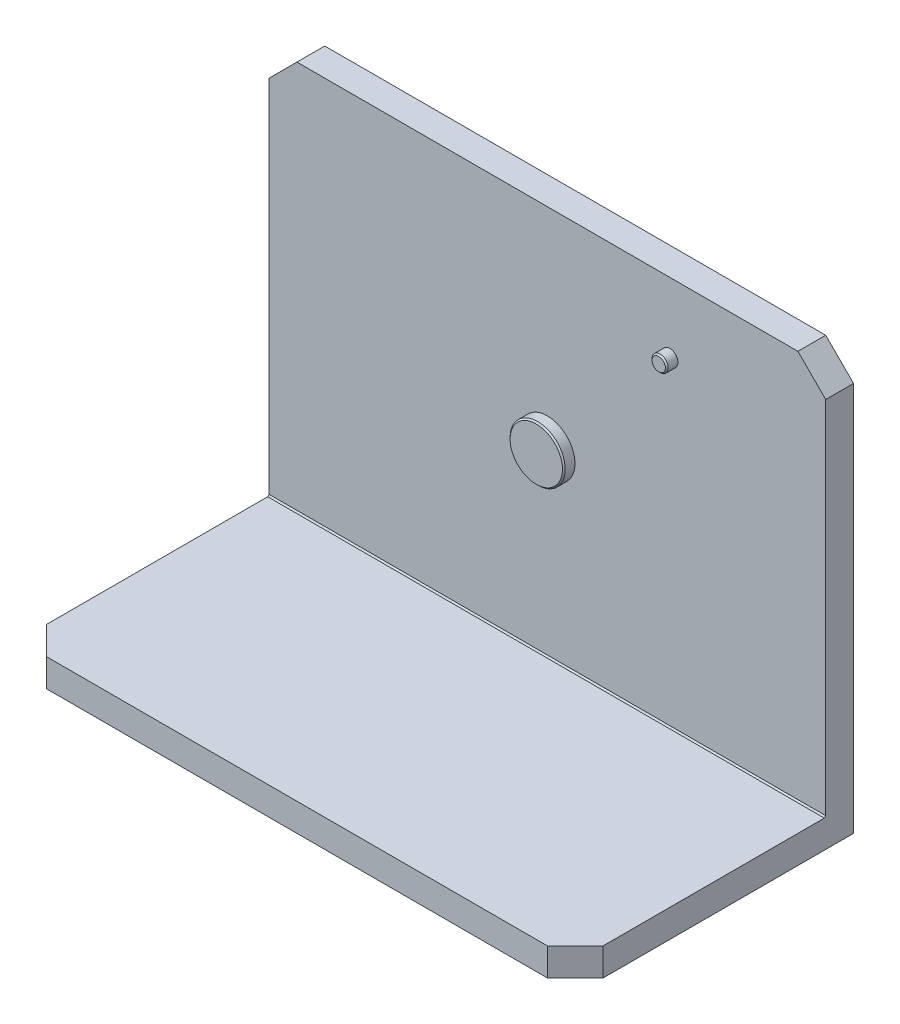
ISO-10303-21;
HEADER;
FILE_DESCRIPTION(('STEP AP214'),'2;1');
FILE_NAME('part.step','',(''),(''),'','','');
FILE_SCHEMA(('AUTOMOTIVE_DESIGN { 1 0 10303 214 1 1 1 1 }'));
ENDSEC;
DATA;
#1=APPLICATION_CONTEXT('core data for automotive mechanical design processes');
#2=APPLICATION_PROTOCOL_DEFINITION('international standard','automotive_design',2000,#1);
#3=PRODUCT_CONTEXT('',#1,'mechanical');
#4=PRODUCT('Part','Part','',(#3));
#5=PRODUCT_RELATED_PRODUCT_CATEGORY('part','',(#4));
#6=PRODUCT_DEFINITION_FORMATION('','',#4);
#7=PRODUCT_DEFINITION_CONTEXT('part definition',#1,'design');
#8=PRODUCT_DEFINITION('design','',#6,#7);
#9=PRODUCT_DEFINITION_SHAPE('','',#8);
#10=(LENGTH_UNIT() NAMED_UNIT(*) SI_UNIT(.MILLI.,.METRE.));
#11=(NAMED_UNIT(*) PLANE_ANGLE_UNIT() SI_UNIT($,.RADIAN.));
#12=(NAMED_UNIT(*) SI_UNIT($,.STERADIAN.) SOLID_ANGLE_UNIT());
#13=UNCERTAINTY_MEASURE_WITH_UNIT(LENGTH_MEASURE(1.E-05),#10,'distance_accuracy_value','');
#14=(GEOMETRIC_REPRESENTATION_CONTEXT(3) GLOBAL_UNCERTAINTY_ASSIGNED_CONTEXT((#13)) GLOBAL_UNIT_ASSIGNED_CONTEXT((#10,
#11,#12)) REPRESENTATION_CONTEXT('',''));
#15=CARTESIAN_POINT('',(0.,0.,0.));
#16=DIRECTION('',(0.,0.,1.));
#17=DIRECTION('',(1.,0.,0.));
#18=AXIS2_PLACEMENT_3D('',#15,#16,#17);
#19=CARTESIAN_POINT('',(0.,0.,5.));
#20=DIRECTION('',(0.,0.,1.));
#21=DIRECTION('',(1.,0.,0.));
#22=AXIS2_PLACEMENT_3D('',#19,#20,#21);
#23=PLANE('',#22);
#24=DIRECTION('',(0.,-1.,0.));
#25=VECTOR('',#24,1.);
#26=CARTESIAN_POINT('',(-50.,37.5,5.));
#27=LINE('',#26,#25);
#28=CARTESIAN_POINT('',(-50.,32.5,5.));
#29=VERTEX_POINT('',#28);
#30=CARTESIAN_POINT('',(-50.,-32.25,5.));
#31=VERTEX_POINT('',#30);
#32=EDGE_CURVE('E157',#29,#31,#27,.T.);
#33=ORIENTED_EDGE('',*,*,#32,.T.);
#34=DIRECTION('',(1.,0.,0.));
#35=VECTOR('',#34,1.);
#36=CARTESIAN_POINT('',(50.,-32.25,5.));
#37=LINE('',#36,#35);
#38=CARTESIAN_POINT('',(50.,-32.25,5.));
#39=VERTEX_POINT('',#38);
#40=EDGE_CURVE('E59',#31,#39,#37,.T.);
#41=ORIENTED_EDGE('',*,*,#40,.T.);
#42=DIRECTION('',(0.,1.,0.));
#43=VECTOR('',#42,1.);
#44=CARTESIAN_POINT('',(50.,37.5,5.));
#45=LINE('',#44,#43);
#46=CARTESIAN_POINT('',(50.,32.5,5.));
#47=VERTEX_POINT('',#46);
#48=EDGE_CURVE('E151',#39,#47,#45,.T.);
#49=ORIENTED_EDGE('',*,*,#48,.T.);
#50=DIRECTION('',(0.707106781186547,-0.707106781186549,0.));
#51=VECTOR('',#50,1.);
#52=CARTESIAN_POINT('',(41.25,41.2499999999999,5.));
#53=LINE('',#52,#51);
#54=CARTESIAN_POINT('',(45.,37.5,5.));
#55=VERTEX_POINT('',#54);
#56=EDGE_CURVE('E170',#47,#55,#53,.F.);
#57=ORIENTED_EDGE('',*,*,#56,.T.);
#58=DIRECTION('',(-1.,0.,0.));
#59=VECTOR('',#58,1.);
#60=CARTESIAN_POINT('',(-50.,37.5,5.));
#61=LINE('',#60,#59);
#62=CARTESIAN_POINT('',(-45.,37.5,5.));
#63=VERTEX_POINT('',#62);
#64=EDGE_CURVE('E153',#55,#63,#61,.T.);
#65=ORIENTED_EDGE('',*,*,#64,.T.);
#66=DIRECTION('',(0.70710678118655,0.707106781186546,0.));
#67=VECTOR('',#66,1.);
#68=CARTESIAN_POINT('',(-41.2499999999999,41.2500000000001,5.));
#69=LINE('',#68,#67);
#70=EDGE_CURVE('E172',#63,#29,#69,.F.);
#71=ORIENTED_EDGE('',*,*,#70,.T.);
#72=EDGE_LOOP('',(#33,#41,#49,#57,#65,#71));
#73=FACE_BOUND('',#72,.T.);
#74=CARTESIAN_POINT('',(22.,25.,5.));
#75=DIRECTION('',(0.,0.,1.));
#76=DIRECTION('',(1.,0.,0.));
#77=AXIS2_PLACEMENT_3D('',#74,#75,#76);
#78=CIRCLE('',#77,1.45);
#79=CARTESIAN_POINT('',(23.45,25.,5.));
#80=VERTEX_POINT('',#79);
#81=EDGE_CURVE('E330',#80,#80,#78,.T.);
#82=ORIENTED_EDGE('',*,*,#81,.F.);
#83=EDGE_LOOP('',(#82));
#84=FACE_BOUND('',#83,.T.);
#85=CARTESIAN_POINT('',(0.,0.,5.));
#86=DIRECTION('',(0.,0.,1.));
#87=DIRECTION('',(1.,0.,0.));
#88=AXIS2_PLACEMENT_3D('',#85,#86,#87);
#89=CIRCLE('',#88,4.95);
#90=CARTESIAN_POINT('',(4.95,0.,5.));
#91=VERTEX_POINT('',#90);
#92=EDGE_CURVE('E333',#91,#91,#89,.T.);
#93=ORIENTED_EDGE('',*,*,#92,.F.);
#94=EDGE_LOOP('',(#93));
#95=FACE_BOUND('',#94,.T.);
#96=ADVANCED_FACE('F43',(#73,#84,#95),#23,.T.);
#97=CARTESIAN_POINT('',(0.,0.,0.));
#98=DIRECTION('',(0.,0.,1.));
#99=DIRECTION('',(1.,0.,0.));
#100=AXIS2_PLACEMENT_3D('',#97,#98,#99);
#101=PLANE('',#100);
#102=DIRECTION('',(0.,-1.,0.));
#103=VECTOR('',#102,1.);
#104=CARTESIAN_POINT('',(-50.,37.5,0.));
#105=LINE('',#104,#103);
#106=CARTESIAN_POINT('',(-50.,32.5,0.));
#107=VERTEX_POINT('',#106);
#108=CARTESIAN_POINT('',(-50.,-37.5,0.));
#109=VERTEX_POINT('',#108);
#110=EDGE_CURVE('E141',#107,#109,#105,.T.);
#111=ORIENTED_EDGE('',*,*,#110,.F.);
#112=DIRECTION('',(-0.70710678118655,-0.707106781186546,0.));
#113=VECTOR('',#112,1.);
#114=CARTESIAN_POINT('',(-50.,32.5,0.));
#115=LINE('',#114,#113);
#116=CARTESIAN_POINT('',(-45.,37.5,0.));
#117=VERTEX_POINT('',#116);
#118=EDGE_CURVE('E163',#107,#117,#115,.F.);
#119=ORIENTED_EDGE('',*,*,#118,.T.);
#120=DIRECTION('',(-1.,0.,0.));
#121=VECTOR('',#120,1.);
#122=CARTESIAN_POINT('',(-50.,37.5,0.));
#123=LINE('',#122,#121);
#124=CARTESIAN_POINT('',(45.,37.5,0.));
#125=VERTEX_POINT('',#124);
#126=EDGE_CURVE('E146',#125,#117,#123,.T.);
#127=ORIENTED_EDGE('',*,*,#126,.F.);
#128=DIRECTION('',(-0.707106781186547,0.707106781186549,0.));
#129=VECTOR('',#128,1.);
#130=CARTESIAN_POINT('',(45.,37.5,0.));
#131=LINE('',#130,#129);
#132=CARTESIAN_POINT('',(50.,32.5,0.));
#133=VERTEX_POINT('',#132);
#134=EDGE_CURVE('E161',#125,#133,#131,.F.);
#135=ORIENTED_EDGE('',*,*,#134,.T.);
#136=DIRECTION('',(0.,1.,0.));
#137=VECTOR('',#136,1.);
#138=CARTESIAN_POINT('',(50.,37.5,0.));
#139=LINE('',#138,#137);
#140=CARTESIAN_POINT('',(50.,-37.5,0.));
#141=VERTEX_POINT('',#140);
#142=EDGE_CURVE('E150',#141,#133,#139,.T.);
#143=ORIENTED_EDGE('',*,*,#142,.F.);
#144=DIRECTION('',(1.,0.,0.));
#145=VECTOR('',#144,1.);
#146=CARTESIAN_POINT('',(-50.,-37.5,0.));
#147=LINE('',#146,#145);
#148=EDGE_CURVE('E131',#109,#141,#147,.T.);
#149=ORIENTED_EDGE('',*,*,#148,.F.);
#150=EDGE_LOOP('',(#111,#119,#127,#135,#143,#149));
#151=FACE_BOUND('',#150,.T.);
#152=ADVANCED_FACE('F148',(#151),#101,.F.);
#153=CARTESIAN_POINT('',(50.,37.5,5.));
#154=DIRECTION('',(-1.,0.,0.));
#155=DIRECTION('',(0.,-1.,0.));
#156=AXIS2_PLACEMENT_3D('',#153,#154,#155);
#157=PLANE('',#156);
#158=ORIENTED_EDGE('',*,*,#142,.T.);
#159=DIRECTION('',(0.,0.,1.));
#160=VECTOR('',#159,1.);
#161=CARTESIAN_POINT('',(50.,32.5,5.));
#162=LINE('',#161,#160);
#163=EDGE_CURVE('E177',#133,#47,#162,.T.);
#164=ORIENTED_EDGE('',*,*,#163,.T.);
#165=ORIENTED_EDGE('',*,*,#48,.F.);
#166=DIRECTION('',(0.,0.707106781186567,-0.707106781186528));
#167=VECTOR('',#166,1.);
#168=CARTESIAN_POINT('',(50.,2.62500000000194,-29.875));
#169=LINE('',#168,#167);
#170=CARTESIAN_POINT('',(50.,-32.5,5.24999999999999));
#171=VERTEX_POINT('',#170);
#172=EDGE_CURVE('E11',#39,#171,#169,.F.);
#173=ORIENTED_EDGE('',*,*,#172,.T.);
#174=DIRECTION('',(0.,0.,1.));
#175=VECTOR('',#174,1.);
#176=CARTESIAN_POINT('',(50.,-32.5,0.));
#177=LINE('',#176,#175);
#178=CARTESIAN_POINT('',(50.,-32.5,45.));
#179=VERTEX_POINT('',#178);
#180=EDGE_CURVE('E310',#171,#179,#177,.T.);
#181=ORIENTED_EDGE('',*,*,#180,.T.);
#182=DIRECTION('',(0.,-1.,0.));
#183=VECTOR('',#182,1.);
#184=CARTESIAN_POINT('',(50.,-37.5,45.));
#185=LINE('',#184,#183);
#186=CARTESIAN_POINT('',(50.,-37.5,45.));
#187=VERTEX_POINT('',#186);
#188=EDGE_CURVE('E174',#179,#187,#185,.T.);
#189=ORIENTED_EDGE('',*,*,#188,.T.);
#190=DIRECTION('',(0.,0.,-1.));
#191=VECTOR('',#190,1.);
#192=CARTESIAN_POINT('',(50.,-37.5,5.));
#193=LINE('',#192,#191);
#194=EDGE_CURVE('E137',#187,#141,#193,.T.);
#195=ORIENTED_EDGE('',*,*,#194,.T.);
#196=EDGE_LOOP('',(#158,#164,#165,#173,#181,#189,#195));
#197=FACE_BOUND('',#196,.T.);
#198=ADVANCED_FACE('F236',(#197),#157,.F.);
#199=CARTESIAN_POINT('',(-50.,37.5,5.));
#200=DIRECTION('',(0.,-1.,0.));
#201=DIRECTION('',(0.,0.,-1.));
#202=AXIS2_PLACEMENT_3D('',#199,#200,#201);
#203=PLANE('',#202);
#204=ORIENTED_EDGE('',*,*,#126,.T.);
#205=DIRECTION('',(0.,0.,1.));
#206=VECTOR('',#205,1.);
#207=CARTESIAN_POINT('',(-45.,37.5,5.));
#208=LINE('',#207,#206);
#209=EDGE_CURVE('E168',#117,#63,#208,.T.);
#210=ORIENTED_EDGE('',*,*,#209,.T.);
#211=ORIENTED_EDGE('',*,*,#64,.F.);
#212=DIRECTION('',(0.,0.,-1.));
#213=VECTOR('',#212,1.);
#214=CARTESIAN_POINT('',(45.,37.5,5.));
#215=LINE('',#214,#213);
#216=EDGE_CURVE('E165',#55,#125,#215,.T.);
#217=ORIENTED_EDGE('',*,*,#216,.T.);
#218=EDGE_LOOP('',(#204,#210,#211,#217));
#219=FACE_BOUND('',#218,.T.);
#220=ADVANCED_FACE('F244',(#219),#203,.F.);
#221=CARTESIAN_POINT('',(-50.,37.5,5.));
#222=DIRECTION('',(1.,0.,0.));
#223=DIRECTION('',(0.,0.,-1.));
#224=AXIS2_PLACEMENT_3D('',#221,#222,#223);
#225=PLANE('',#224);
#226=ORIENTED_EDGE('',*,*,#32,.F.);
#227=DIRECTION('',(0.,0.,-1.));
#228=VECTOR('',#227,1.);
#229=CARTESIAN_POINT('',(-50.,32.5,5.));
#230=LINE('',#229,#228);
#231=EDGE_CURVE('E144',#29,#107,#230,.T.);
#232=ORIENTED_EDGE('',*,*,#231,.T.);
#233=ORIENTED_EDGE('',*,*,#110,.T.);
#234=DIRECTION('',(0.,0.,-1.));
#235=VECTOR('',#234,1.);
#236=CARTESIAN_POINT('',(-50.,-37.5,5.));
#237=LINE('',#236,#235);
#238=CARTESIAN_POINT('',(-50.,-37.5,45.));
#239=VERTEX_POINT('',#238);
#240=EDGE_CURVE('E126',#239,#109,#237,.T.);
#241=ORIENTED_EDGE('',*,*,#240,.F.);
#242=DIRECTION('',(0.,1.,0.));
#243=VECTOR('',#242,1.);
#244=CARTESIAN_POINT('',(-50.,-32.5,45.));
#245=LINE('',#244,#243);
#246=CARTESIAN_POINT('',(-50.,-32.5,45.));
#247=VERTEX_POINT('',#246);
#248=EDGE_CURVE('E136',#239,#247,#245,.T.);
#249=ORIENTED_EDGE('',*,*,#248,.T.);
#250=DIRECTION('',(0.,0.,-1.));
#251=VECTOR('',#250,1.);
#252=CARTESIAN_POINT('',(-50.,-32.5,0.));
#253=LINE('',#252,#251);
#254=CARTESIAN_POINT('',(-50.,-32.5,5.24999999999999));
#255=VERTEX_POINT('',#254);
#256=EDGE_CURVE('E317',#247,#255,#253,.T.);
#257=ORIENTED_EDGE('',*,*,#256,.T.);
#258=DIRECTION('',(0.,-0.707106781186567,0.707106781186528));
#259=VECTOR('',#258,1.);
#260=CARTESIAN_POINT('',(-50.,2.62500000000194,-29.875));
#261=LINE('',#260,#259);
#262=EDGE_CURVE('E52',#255,#31,#261,.F.);
#263=ORIENTED_EDGE('',*,*,#262,.T.);
#264=EDGE_LOOP('',(#226,#232,#233,#241,#249,#257,#263));
#265=FACE_BOUND('',#264,.T.);
#266=ADVANCED_FACE('F142',(#265),#225,.F.);
#267=CARTESIAN_POINT('',(-50.,-37.5,5.));
#268=DIRECTION('',(0.,1.,0.));
#269=DIRECTION('',(0.,0.,1.));
#270=AXIS2_PLACEMENT_3D('',#267,#268,#269);
#271=PLANE('',#270);
#272=ORIENTED_EDGE('',*,*,#194,.F.);
#273=DIRECTION('',(-0.707106781186549,0.,0.707106781186546));
#274=VECTOR('',#273,1.);
#275=CARTESIAN_POINT('',(50.,-37.5,45.));
#276=LINE('',#275,#274);
#277=CARTESIAN_POINT('',(45.,-37.5,50.));
#278=VERTEX_POINT('',#277);
#279=EDGE_CURVE('E181',#187,#278,#276,.T.);
#280=ORIENTED_EDGE('',*,*,#279,.T.);
#281=DIRECTION('',(-1.,0.,0.));
#282=VECTOR('',#281,1.);
#283=CARTESIAN_POINT('',(-50.,-37.5,50.));
#284=LINE('',#283,#282);
#285=CARTESIAN_POINT('',(-45.,-37.5,50.));
#286=VERTEX_POINT('',#285);
#287=EDGE_CURVE('E339',#278,#286,#284,.T.);
#288=ORIENTED_EDGE('',*,*,#287,.T.);
#289=DIRECTION('',(-0.707106781186546,0.,-0.70710678118655));
#290=VECTOR('',#289,1.);
#291=CARTESIAN_POINT('',(-45.,-37.5,50.));
#292=LINE('',#291,#290);
#293=EDGE_CURVE('E134',#286,#239,#292,.T.);
#294=ORIENTED_EDGE('',*,*,#293,.T.);
#295=ORIENTED_EDGE('',*,*,#240,.T.);
#296=ORIENTED_EDGE('',*,*,#148,.T.);
#297=EDGE_LOOP('',(#272,#280,#288,#294,#295,#296));
#298=FACE_BOUND('',#297,.T.);
#299=ADVANCED_FACE('F129',(#298),#271,.F.);
#300=CARTESIAN_POINT('',(0.,0.,7.));
#301=DIRECTION('',(0.,0.,-1.));
#302=DIRECTION('',(-1.,0.,0.));
#303=AXIS2_PLACEMENT_3D('',#300,#301,#302);
#304=CYLINDRICAL_SURFACE('',#303,4.95);
#305=CARTESIAN_POINT('',(0.,0.,6.74999999999998));
#306=DIRECTION('',(0.,0.,1.));
#307=DIRECTION('',(1.,0.,0.));
#308=AXIS2_PLACEMENT_3D('',#305,#306,#307);
#309=CIRCLE('',#308,4.95);
#310=CARTESIAN_POINT('',(4.95,0.,6.74999999999998));
#311=VERTEX_POINT('',#310);
#312=EDGE_CURVE('E206',#311,#311,#309,.F.);
#313=ORIENTED_EDGE('',*,*,#312,.T.);
#314=EDGE_LOOP('',(#313));
#315=FACE_BOUND('',#314,.T.);
#316=ORIENTED_EDGE('',*,*,#92,.T.);
#317=EDGE_LOOP('',(#316));
#318=FACE_BOUND('',#317,.T.);
#319=ADVANCED_FACE('F210',(#315,#318),#304,.T.);
#320=CARTESIAN_POINT('',(0.,0.,7.));
#321=DIRECTION('',(0.,0.,1.));
#322=DIRECTION('',(1.,0.,0.));
#323=AXIS2_PLACEMENT_3D('',#320,#321,#322);
#324=PLANE('',#323);
#325=CARTESIAN_POINT('',(0.,0.,7.));
#326=DIRECTION('',(0.,0.,1.));
#327=DIRECTION('',(1.,0.,0.));
#328=AXIS2_PLACEMENT_3D('',#325,#326,#327);
#329=CIRCLE('',#328,4.69999999999997);
#330=CARTESIAN_POINT('',(4.69999999999997,0.,7.));
#331=VERTEX_POINT('',#330);
#332=EDGE_CURVE('E203',#331,#331,#329,.T.);
#333=ORIENTED_EDGE('',*,*,#332,.T.);
#334=EDGE_LOOP('',(#333));
#335=FACE_BOUND('',#334,.T.);
#336=ADVANCED_FACE('F218',(#335),#324,.T.);
#337=CARTESIAN_POINT('',(22.,25.,7.));
#338=DIRECTION('',(0.,0.,-1.));
#339=DIRECTION('',(-1.,0.,0.));
#340=AXIS2_PLACEMENT_3D('',#337,#338,#339);
#341=CYLINDRICAL_SURFACE('',#340,1.45);
#342=CARTESIAN_POINT('',(22.,25.,6.75));
#343=DIRECTION('',(0.,0.,1.));
#344=DIRECTION('',(1.,0.,0.));
#345=AXIS2_PLACEMENT_3D('',#342,#343,#344);
#346=CIRCLE('',#345,1.45);
#347=CARTESIAN_POINT('',(23.45,25.,6.75));
#348=VERTEX_POINT('',#347);
#349=EDGE_CURVE('E200',#348,#348,#346,.F.);
#350=ORIENTED_EDGE('',*,*,#349,.T.);
#351=EDGE_LOOP('',(#350));
#352=FACE_BOUND('',#351,.T.);
#353=ORIENTED_EDGE('',*,*,#81,.T.);
#354=EDGE_LOOP('',(#353));
#355=FACE_BOUND('',#354,.T.);
#356=ADVANCED_FACE('F220',(#352,#355),#341,.T.);
#357=CARTESIAN_POINT('',(22.,25.,7.));
#358=DIRECTION('',(0.,0.,1.));
#359=DIRECTION('',(1.,0.,0.));
#360=AXIS2_PLACEMENT_3D('',#357,#358,#359);
#361=PLANE('',#360);
#362=CARTESIAN_POINT('',(22.,25.,7.));
#363=DIRECTION('',(0.,0.,1.));
#364=DIRECTION('',(1.,0.,0.));
#365=AXIS2_PLACEMENT_3D('',#362,#363,#364);
#366=CIRCLE('',#365,1.19999999999999);
#367=CARTESIAN_POINT('',(23.2,25.,7.));
#368=VERTEX_POINT('',#367);
#369=EDGE_CURVE('E197',#368,#368,#366,.T.);
#370=ORIENTED_EDGE('',*,*,#369,.T.);
#371=EDGE_LOOP('',(#370));
#372=FACE_BOUND('',#371,.T.);
#373=ADVANCED_FACE('F226',(#372),#361,.T.);
#374=CARTESIAN_POINT('',(-50.,-32.5,50.));
#375=DIRECTION('',(0.,0.,1.));
#376=DIRECTION('',(1.,0.,0.));
#377=AXIS2_PLACEMENT_3D('',#374,#375,#376);
#378=PLANE('',#377);
#379=ORIENTED_EDGE('',*,*,#287,.F.);
#380=DIRECTION('',(0.,1.,0.));
#381=VECTOR('',#380,1.);
#382=CARTESIAN_POINT('',(45.,-32.5,50.));
#383=LINE('',#382,#381);
#384=CARTESIAN_POINT('',(45.,-32.5,50.));
#385=VERTEX_POINT('',#384);
#386=EDGE_CURVE('E186',#278,#385,#383,.T.);
#387=ORIENTED_EDGE('',*,*,#386,.T.);
#388=DIRECTION('',(-1.,0.,0.));
#389=VECTOR('',#388,1.);
#390=CARTESIAN_POINT('',(-50.,-32.5,50.));
#391=LINE('',#390,#389);
#392=CARTESIAN_POINT('',(-45.,-32.5,50.));
#393=VERTEX_POINT('',#392);
#394=EDGE_CURVE('E316',#385,#393,#391,.T.);
#395=ORIENTED_EDGE('',*,*,#394,.T.);
#396=DIRECTION('',(0.,-1.,0.));
#397=VECTOR('',#396,1.);
#398=CARTESIAN_POINT('',(-45.,-37.5,50.));
#399=LINE('',#398,#397);
#400=EDGE_CURVE('E183',#393,#286,#399,.T.);
#401=ORIENTED_EDGE('',*,*,#400,.T.);
#402=EDGE_LOOP('',(#379,#387,#395,#401));
#403=FACE_BOUND('',#402,.T.);
#404=ADVANCED_FACE('F298',(#403),#378,.T.);
#405=CARTESIAN_POINT('',(0.,-32.5,0.));
#406=DIRECTION('',(0.,1.,0.));
#407=DIRECTION('',(0.,0.,1.));
#408=AXIS2_PLACEMENT_3D('',#405,#406,#407);
#409=PLANE('',#408);
#410=ORIENTED_EDGE('',*,*,#180,.F.);
#411=DIRECTION('',(-1.,0.,0.));
#412=VECTOR('',#411,1.);
#413=CARTESIAN_POINT('',(-50.,-32.5,5.24999999999999));
#414=LINE('',#413,#412);
#415=EDGE_CURVE('E193',#171,#255,#414,.T.);
#416=ORIENTED_EDGE('',*,*,#415,.T.);
#417=ORIENTED_EDGE('',*,*,#256,.F.);
#418=DIRECTION('',(0.707106781186546,0.,0.70710678118655));
#419=VECTOR('',#418,1.);
#420=CARTESIAN_POINT('',(-47.5000000000001,-32.5,47.4999999999999));
#421=LINE('',#420,#419);
#422=EDGE_CURVE('E188',#247,#393,#421,.T.);
#423=ORIENTED_EDGE('',*,*,#422,.T.);
#424=ORIENTED_EDGE('',*,*,#394,.F.);
#425=DIRECTION('',(0.707106781186549,0.,-0.707106781186546));
#426=VECTOR('',#425,1.);
#427=CARTESIAN_POINT('',(47.4999999999999,-32.5,47.5000000000001));
#428=LINE('',#427,#426);
#429=EDGE_CURVE('E190',#385,#179,#428,.T.);
#430=ORIENTED_EDGE('',*,*,#429,.T.);
#431=EDGE_LOOP('',(#410,#416,#417,#423,#424,#430));
#432=FACE_BOUND('',#431,.T.);
#433=ADVANCED_FACE('F259',(#432),#409,.T.);
#434=CARTESIAN_POINT('',(-50.,32.5,5.));
#435=DIRECTION('',(0.707106781186545,-0.707106781186549,0.));
#436=DIRECTION('',(0.,0.,-1.));
#437=AXIS2_PLACEMENT_3D('',#434,#435,#436);
#438=PLANE('',#437);
#439=ORIENTED_EDGE('',*,*,#70,.F.);
#440=ORIENTED_EDGE('',*,*,#209,.F.);
#441=ORIENTED_EDGE('',*,*,#118,.F.);
#442=ORIENTED_EDGE('',*,*,#231,.F.);
#443=EDGE_LOOP('',(#439,#440,#441,#442));
#444=FACE_BOUND('',#443,.T.);
#445=ADVANCED_FACE('F252',(#444),#438,.F.);
#446=CARTESIAN_POINT('',(45.,37.5,5.));
#447=DIRECTION('',(-0.707106781186549,-0.707106781186547,0.));
#448=DIRECTION('',(0.,0.,-1.));
#449=AXIS2_PLACEMENT_3D('',#446,#447,#448);
#450=PLANE('',#449);
#451=ORIENTED_EDGE('',*,*,#56,.F.);
#452=ORIENTED_EDGE('',*,*,#163,.F.);
#453=ORIENTED_EDGE('',*,*,#134,.F.);
#454=ORIENTED_EDGE('',*,*,#216,.F.);
#455=EDGE_LOOP('',(#451,#452,#453,#454));
#456=FACE_BOUND('',#455,.T.);
#457=ADVANCED_FACE('F258',(#456),#450,.F.);
#458=CARTESIAN_POINT('',(50.,37.5,45.));
#459=DIRECTION('',(0.707106781186546,0.,0.707106781186549));
#460=DIRECTION('',(0.,1.,0.));
#461=AXIS2_PLACEMENT_3D('',#458,#459,#460);
#462=PLANE('',#461);
#463=ORIENTED_EDGE('',*,*,#429,.F.);
#464=ORIENTED_EDGE('',*,*,#386,.F.);
#465=ORIENTED_EDGE('',*,*,#279,.F.);
#466=ORIENTED_EDGE('',*,*,#188,.F.);
#467=EDGE_LOOP('',(#463,#464,#465,#466));
#468=FACE_BOUND('',#467,.T.);
#469=ADVANCED_FACE('F266',(#468),#462,.T.);
#470=CARTESIAN_POINT('',(-45.,-32.5,50.));
#471=DIRECTION('',(-0.707106781186549,0.,0.707106781186545));
#472=DIRECTION('',(0.,1.,0.));
#473=AXIS2_PLACEMENT_3D('',#470,#471,#472);
#474=PLANE('',#473);
#475=ORIENTED_EDGE('',*,*,#422,.F.);
#476=ORIENTED_EDGE('',*,*,#248,.F.);
#477=ORIENTED_EDGE('',*,*,#293,.F.);
#478=ORIENTED_EDGE('',*,*,#400,.F.);
#479=EDGE_LOOP('',(#475,#476,#477,#478));
#480=FACE_BOUND('',#479,.T.);
#481=ADVANCED_FACE('F273',(#480),#474,.T.);
#482=CARTESIAN_POINT('',(0.,-32.5,5.24999999999999));
#483=DIRECTION('',(0.,0.707106781186528,0.707106781186567));
#484=DIRECTION('',(1.,0.,0.));
#485=AXIS2_PLACEMENT_3D('',#482,#483,#484);
#486=PLANE('',#485);
#487=ORIENTED_EDGE('',*,*,#172,.F.);
#488=ORIENTED_EDGE('',*,*,#40,.F.);
#489=ORIENTED_EDGE('',*,*,#262,.F.);
#490=ORIENTED_EDGE('',*,*,#415,.F.);
#491=EDGE_LOOP('',(#487,#488,#489,#490));
#492=FACE_BOUND('',#491,.T.);
#493=ADVANCED_FACE('F280',(#492),#486,.T.);
#494=CARTESIAN_POINT('',(22.,25.,7.));
#495=DIRECTION('',(0.,0.,-1.));
#496=DIRECTION('',(-1.,0.,0.));
#497=AXIS2_PLACEMENT_3D('',#494,#495,#496);
#498=CONICAL_SURFACE('',#497,1.19999999999999,0.785398163397459);
#499=ORIENTED_EDGE('',*,*,#349,.F.);
#500=EDGE_LOOP('',(#499));
#501=FACE_BOUND('',#500,.T.);
#502=ORIENTED_EDGE('',*,*,#369,.F.);
#503=EDGE_LOOP('',(#502));
#504=FACE_BOUND('',#503,.T.);
#505=ADVANCED_FACE('F215',(#501,#504),#498,.T.);
#506=CARTESIAN_POINT('',(0.,0.,7.));
#507=DIRECTION('',(0.,0.,-1.));
#508=DIRECTION('',(-1.,0.,0.));
#509=AXIS2_PLACEMENT_3D('',#506,#507,#508);
#510=CONICAL_SURFACE('',#509,4.69999999999997,0.785398163397469);
#511=ORIENTED_EDGE('',*,*,#312,.F.);
#512=EDGE_LOOP('',(#511));
#513=FACE_BOUND('',#512,.T.);
#514=ORIENTED_EDGE('',*,*,#332,.F.);
#515=EDGE_LOOP('',(#514));
#516=FACE_BOUND('',#515,.T.);
#517=ADVANCED_FACE('F46',(#513,#516),#510,.T.);
#518=CLOSED_SHELL('',(#96,#152,#198,#220,#266,#299,#319,#336,#356,#373,#404,#433,#445,#457,#469,
#481,#493,#505,#517));
#519=MANIFOLD_SOLID_BREP('B2',#518);
#520=ADVANCED_BREP_SHAPE_REPRESENTATION('',(#18,#519),#14);
#521=SHAPE_DEFINITION_REPRESENTATION(#9,#520);
ENDSEC;
END-ISO-10303-21;
